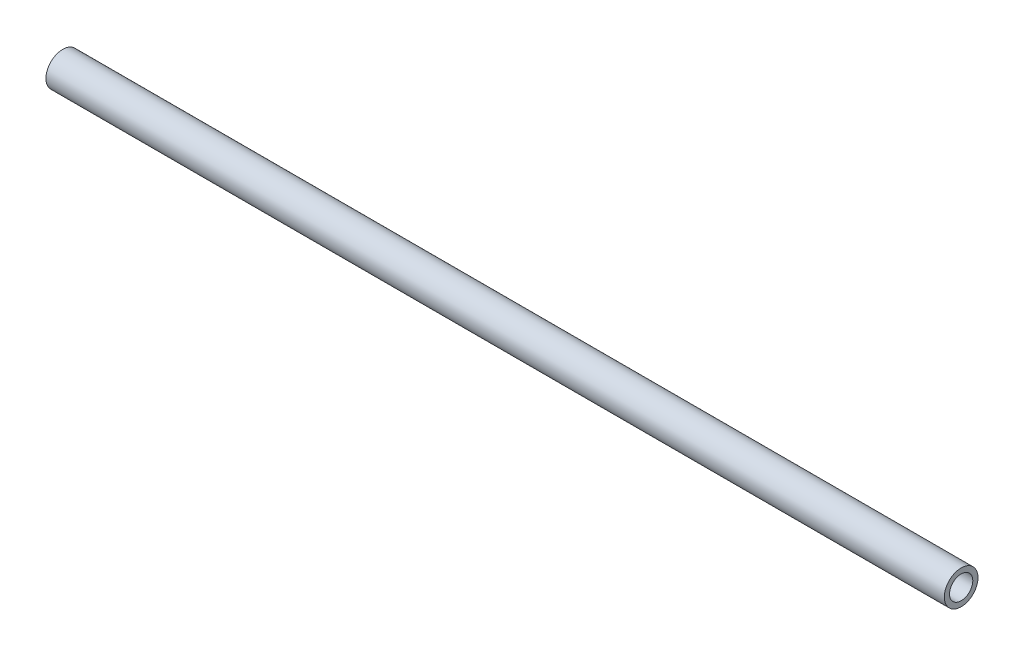
ISO-10303-21;
HEADER;
FILE_DESCRIPTION(('STEP AP214'),'2;1');
FILE_NAME('part.step','',(''),(''),'','','');
FILE_SCHEMA(('AUTOMOTIVE_DESIGN { 1 0 10303 214 1 1 1 1 }'));
ENDSEC;
DATA;
#1=APPLICATION_CONTEXT('core data for automotive mechanical design processes');
#2=APPLICATION_PROTOCOL_DEFINITION('international standard','automotive_design',2000,#1);
#3=PRODUCT_CONTEXT('',#1,'mechanical');
#4=PRODUCT('Part','Part','',(#3));
#5=PRODUCT_RELATED_PRODUCT_CATEGORY('part','',(#4));
#6=PRODUCT_DEFINITION_FORMATION('','',#4);
#7=PRODUCT_DEFINITION_CONTEXT('part definition',#1,'design');
#8=PRODUCT_DEFINITION('design','',#6,#7);
#9=PRODUCT_DEFINITION_SHAPE('','',#8);
#10=(LENGTH_UNIT() NAMED_UNIT(*) SI_UNIT(.MILLI.,.METRE.));
#11=(NAMED_UNIT(*) PLANE_ANGLE_UNIT() SI_UNIT($,.RADIAN.));
#12=(NAMED_UNIT(*) SI_UNIT($,.STERADIAN.) SOLID_ANGLE_UNIT());
#13=UNCERTAINTY_MEASURE_WITH_UNIT(LENGTH_MEASURE(1.E-05),#10,'distance_accuracy_value','');
#14=(GEOMETRIC_REPRESENTATION_CONTEXT(3) GLOBAL_UNCERTAINTY_ASSIGNED_CONTEXT((#13)) GLOBAL_UNIT_ASSIGNED_CONTEXT((#10,
#11,#12)) REPRESENTATION_CONTEXT('',''));
#15=CARTESIAN_POINT('',(0.,0.,0.));
#16=DIRECTION('',(0.,0.,1.));
#17=DIRECTION('',(1.,0.,0.));
#18=AXIS2_PLACEMENT_3D('',#15,#16,#17);
#19=CARTESIAN_POINT('',(127.,0.,0.));
#20=DIRECTION('',(1.,0.,0.));
#21=DIRECTION('',(0.,0.,-1.));
#22=AXIS2_PLACEMENT_3D('',#19,#20,#21);
#23=PLANE('',#22);
#24=CARTESIAN_POINT('',(127.,0.,0.));
#25=DIRECTION('',(1.,0.,0.));
#26=DIRECTION('',(0.,0.,-1.));
#27=AXIS2_PLACEMENT_3D('',#24,#25,#26);
#28=CIRCLE('',#27,4.7625);
#29=CARTESIAN_POINT('',(127.,0.,-4.7625));
#30=VERTEX_POINT('',#29);
#31=EDGE_CURVE('E10',#30,#30,#28,.T.);
#32=ORIENTED_EDGE('',*,*,#31,.T.);
#33=EDGE_LOOP('',(#32));
#34=FACE_BOUND('',#33,.T.);
#35=CARTESIAN_POINT('',(127.,0.,0.));
#36=DIRECTION('',(1.,0.,0.));
#37=DIRECTION('',(0.,0.,-1.));
#38=AXIS2_PLACEMENT_3D('',#35,#36,#37);
#39=CIRCLE('',#38,3.2893);
#40=CARTESIAN_POINT('',(127.,0.,-3.2893));
#41=VERTEX_POINT('',#40);
#42=EDGE_CURVE('E46',#41,#41,#39,.T.);
#43=ORIENTED_EDGE('',*,*,#42,.F.);
#44=EDGE_LOOP('',(#43));
#45=FACE_BOUND('',#44,.T.);
#46=ADVANCED_FACE('F34',(#34,#45),#23,.T.);
#47=CARTESIAN_POINT('',(-127.,0.,0.));
#48=DIRECTION('',(1.,0.,0.));
#49=DIRECTION('',(0.,0.,-1.));
#50=AXIS2_PLACEMENT_3D('',#47,#48,#49);
#51=PLANE('',#50);
#52=CARTESIAN_POINT('',(-127.,0.,0.));
#53=DIRECTION('',(1.,0.,0.));
#54=DIRECTION('',(0.,0.,-1.));
#55=AXIS2_PLACEMENT_3D('',#52,#53,#54);
#56=CIRCLE('',#55,4.7625);
#57=CARTESIAN_POINT('',(-127.,0.,-4.7625));
#58=VERTEX_POINT('',#57);
#59=EDGE_CURVE('E39',#58,#58,#56,.T.);
#60=ORIENTED_EDGE('',*,*,#59,.F.);
#61=EDGE_LOOP('',(#60));
#62=FACE_BOUND('',#61,.T.);
#63=CARTESIAN_POINT('',(-127.,0.,0.));
#64=DIRECTION('',(1.,0.,0.));
#65=DIRECTION('',(0.,0.,-1.));
#66=AXIS2_PLACEMENT_3D('',#63,#64,#65);
#67=CIRCLE('',#66,3.2893);
#68=CARTESIAN_POINT('',(-127.,0.,-3.2893));
#69=VERTEX_POINT('',#68);
#70=EDGE_CURVE('E48',#69,#69,#67,.T.);
#71=ORIENTED_EDGE('',*,*,#70,.T.);
#72=EDGE_LOOP('',(#71));
#73=FACE_BOUND('',#72,.T.);
#74=ADVANCED_FACE('F59',(#62,#73),#51,.F.);
#75=CARTESIAN_POINT('',(127.,0.,0.));
#76=DIRECTION('',(-1.,0.,0.));
#77=DIRECTION('',(0.,0.,1.));
#78=AXIS2_PLACEMENT_3D('',#75,#76,#77);
#79=CYLINDRICAL_SURFACE('',#78,4.7625);
#80=ORIENTED_EDGE('',*,*,#31,.F.);
#81=EDGE_LOOP('',(#80));
#82=FACE_BOUND('',#81,.T.);
#83=ORIENTED_EDGE('',*,*,#59,.T.);
#84=EDGE_LOOP('',(#83));
#85=FACE_BOUND('',#84,.T.);
#86=ADVANCED_FACE('F40',(#82,#85),#79,.T.);
#87=CARTESIAN_POINT('',(127.,0.,0.));
#88=DIRECTION('',(-1.,0.,0.));
#89=DIRECTION('',(0.,0.,1.));
#90=AXIS2_PLACEMENT_3D('',#87,#88,#89);
#91=CYLINDRICAL_SURFACE('',#90,3.2893);
#92=ORIENTED_EDGE('',*,*,#42,.T.);
#93=EDGE_LOOP('',(#92));
#94=FACE_BOUND('',#93,.T.);
#95=ORIENTED_EDGE('',*,*,#70,.F.);
#96=EDGE_LOOP('',(#95));
#97=FACE_BOUND('',#96,.T.);
#98=ADVANCED_FACE('F53',(#94,#97),#91,.F.);
#99=CLOSED_SHELL('',(#46,#74,#86,#98));
#100=MANIFOLD_SOLID_BREP('B2',#99);
#101=ADVANCED_BREP_SHAPE_REPRESENTATION('',(#18,#100),#14);
#102=SHAPE_DEFINITION_REPRESENTATION(#9,#101);
ENDSEC;
END-ISO-10303-21;
